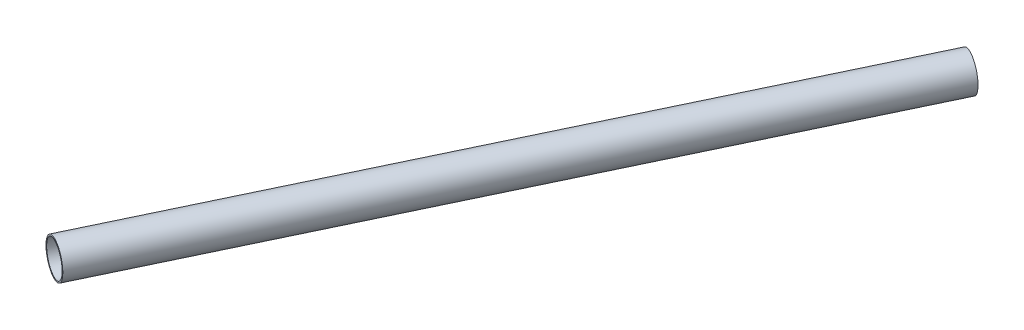
ISO-10303-21;
HEADER;
FILE_DESCRIPTION(('STEP AP214'),'2;1');
FILE_NAME('part.step','',(''),(''),'','','');
FILE_SCHEMA(('AUTOMOTIVE_DESIGN { 1 0 10303 214 1 1 1 1 }'));
ENDSEC;
DATA;
#1=APPLICATION_CONTEXT('core data for automotive mechanical design processes');
#2=APPLICATION_PROTOCOL_DEFINITION('international standard','automotive_design',2000,#1);
#3=PRODUCT_CONTEXT('',#1,'mechanical');
#4=PRODUCT('Part','Part','',(#3));
#5=PRODUCT_RELATED_PRODUCT_CATEGORY('part','',(#4));
#6=PRODUCT_DEFINITION_FORMATION('','',#4);
#7=PRODUCT_DEFINITION_CONTEXT('part definition',#1,'design');
#8=PRODUCT_DEFINITION('design','',#6,#7);
#9=PRODUCT_DEFINITION_SHAPE('','',#8);
#10=(LENGTH_UNIT() NAMED_UNIT(*) SI_UNIT(.MILLI.,.METRE.));
#11=(NAMED_UNIT(*) PLANE_ANGLE_UNIT() SI_UNIT($,.RADIAN.));
#12=(NAMED_UNIT(*) SI_UNIT($,.STERADIAN.) SOLID_ANGLE_UNIT());
#13=UNCERTAINTY_MEASURE_WITH_UNIT(LENGTH_MEASURE(1.E-05),#10,'distance_accuracy_value','');
#14=(GEOMETRIC_REPRESENTATION_CONTEXT(3) GLOBAL_UNCERTAINTY_ASSIGNED_CONTEXT((#13)) GLOBAL_UNIT_ASSIGNED_CONTEXT((#10,
#11,#12)) REPRESENTATION_CONTEXT('',''));
#15=CARTESIAN_POINT('',(0.,0.,0.));
#16=DIRECTION('',(0.,0.,1.));
#17=DIRECTION('',(1.,0.,0.));
#18=AXIS2_PLACEMENT_3D('',#15,#16,#17);
#19=CARTESIAN_POINT('',(15.4510965425071,0.,-110.));
#20=DIRECTION('',(0.430367669974382,0.,-0.902653681453093));
#21=DIRECTION('',(-0.902653681453093,0.,-0.430367669974382));
#22=AXIS2_PLACEMENT_3D('',#19,#20,#21);
#23=PLANE('',#22);
#24=CARTESIAN_POINT('',(15.4510965425062,0.,-110.));
#25=DIRECTION('',(0.430367669974382,0.,-0.902653681453093));
#26=DIRECTION('',(-0.902653681453093,0.,-0.430367669974382));
#27=AXIS2_PLACEMENT_3D('',#24,#25,#26);
#28=CIRCLE('',#27,11.5);
#29=CARTESIAN_POINT('',(5.07057920579567,0.,-114.949228204706));
#30=VERTEX_POINT('',#29);
#31=EDGE_CURVE('E62',#30,#30,#28,.F.);
#32=ORIENTED_EDGE('',*,*,#31,.F.);
#33=EDGE_LOOP('',(#32));
#34=FACE_BOUND('',#33,.T.);
#35=CARTESIAN_POINT('',(15.4510965425071,0.,-110.));
#36=DIRECTION('',(0.430367669974382,0.,-0.902653681453093));
#37=DIRECTION('',(-0.902653681453093,0.,-0.430367669974382));
#38=AXIS2_PLACEMENT_3D('',#35,#36,#37);
#39=CIRCLE('',#38,12.5);
#40=CARTESIAN_POINT('',(4.1679255243434,0.,-115.37959587468));
#41=VERTEX_POINT('',#40);
#42=EDGE_CURVE('E54',#41,#41,#39,.T.);
#43=ORIENTED_EDGE('',*,*,#42,.F.);
#44=EDGE_LOOP('',(#43));
#45=FACE_BOUND('',#44,.T.);
#46=ADVANCED_FACE('F48',(#34,#45),#23,.F.);
#47=CARTESIAN_POINT('',(223.369661717017,0.,-546.088654866634));
#48=DIRECTION('',(0.430367669974382,0.,-0.902653681453093));
#49=DIRECTION('',(-0.902653681453093,0.,-0.430367669974382));
#50=AXIS2_PLACEMENT_3D('',#47,#48,#49);
#51=PLANE('',#50);
#52=CARTESIAN_POINT('',(223.369661717016,0.,-546.088654866634));
#53=DIRECTION('',(0.430367669974382,0.,-0.902653681453093));
#54=DIRECTION('',(-0.902653681453093,0.,-0.430367669974382));
#55=AXIS2_PLACEMENT_3D('',#52,#53,#54);
#56=CIRCLE('',#55,11.5);
#57=CARTESIAN_POINT('',(212.989144380305,0.,-551.03788307134));
#58=VERTEX_POINT('',#57);
#59=EDGE_CURVE('E58',#58,#58,#56,.F.);
#60=ORIENTED_EDGE('',*,*,#59,.T.);
#61=EDGE_LOOP('',(#60));
#62=FACE_BOUND('',#61,.T.);
#63=CARTESIAN_POINT('',(223.369661717017,0.,-546.088654866634));
#64=DIRECTION('',(0.430367669974382,0.,-0.902653681453093));
#65=DIRECTION('',(-0.902653681453093,0.,-0.430367669974382));
#66=AXIS2_PLACEMENT_3D('',#63,#64,#65);
#67=CIRCLE('',#66,12.5);
#68=CARTESIAN_POINT('',(212.086490698853,0.,-551.468250741314));
#69=VERTEX_POINT('',#68);
#70=EDGE_CURVE('E11',#69,#69,#67,.T.);
#71=ORIENTED_EDGE('',*,*,#70,.T.);
#72=EDGE_LOOP('',(#71));
#73=FACE_BOUND('',#72,.T.);
#74=ADVANCED_FACE('F73',(#62,#73),#51,.T.);
#75=CARTESIAN_POINT('',(15.4510965425071,0.,-110.));
#76=DIRECTION('',(0.430367669974382,0.,-0.902653681453093));
#77=DIRECTION('',(-0.902653681453093,0.,-0.430367669974382));
#78=AXIS2_PLACEMENT_3D('',#75,#76,#77);
#79=CYLINDRICAL_SURFACE('',#78,12.5);
#80=ORIENTED_EDGE('',*,*,#70,.F.);
#81=EDGE_LOOP('',(#80));
#82=FACE_BOUND('',#81,.T.);
#83=ORIENTED_EDGE('',*,*,#42,.T.);
#84=EDGE_LOOP('',(#83));
#85=FACE_BOUND('',#84,.T.);
#86=ADVANCED_FACE('F77',(#82,#85),#79,.T.);
#87=CARTESIAN_POINT('',(15.0207288725317,0.,-109.097346318547));
#88=DIRECTION('',(0.430367669974382,0.,-0.902653681453093));
#89=DIRECTION('',(-0.902653681453093,0.,-0.430367669974382));
#90=AXIS2_PLACEMENT_3D('',#87,#88,#89);
#91=CYLINDRICAL_SURFACE('',#90,11.5);
#92=ORIENTED_EDGE('',*,*,#31,.T.);
#93=EDGE_LOOP('',(#92));
#94=FACE_BOUND('',#93,.T.);
#95=ORIENTED_EDGE('',*,*,#59,.F.);
#96=EDGE_LOOP('',(#95));
#97=FACE_BOUND('',#96,.T.);
#98=ADVANCED_FACE('F68',(#94,#97),#91,.F.);
#99=CLOSED_SHELL('',(#46,#74,#86,#98));
#100=MANIFOLD_SOLID_BREP('B2',#99);
#101=ADVANCED_BREP_SHAPE_REPRESENTATION('',(#18,#100),#14);
#102=SHAPE_DEFINITION_REPRESENTATION(#9,#101);
ENDSEC;
END-ISO-10303-21;
